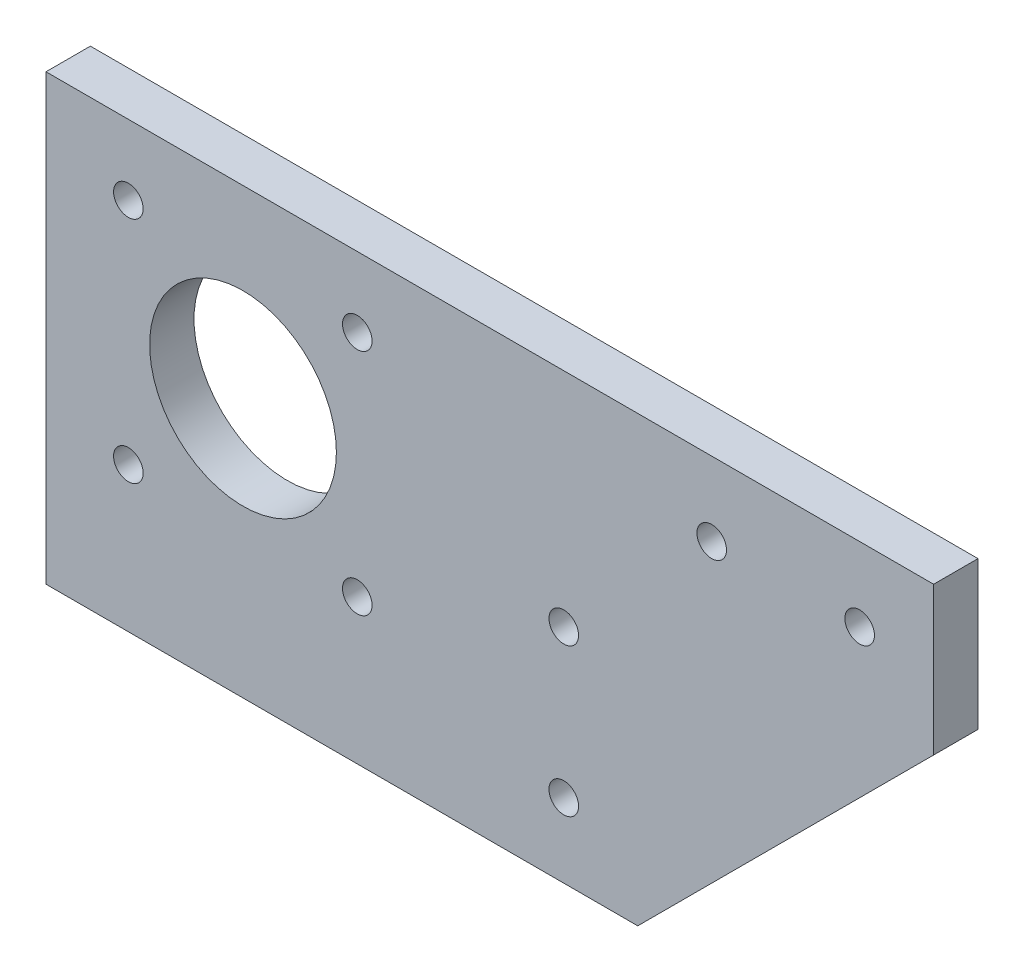
ISO-10303-21;
HEADER;
FILE_DESCRIPTION(('STEP AP214'),'2;1');
FILE_NAME('part.step','',(''),(''),'','','');
FILE_SCHEMA(('AUTOMOTIVE_DESIGN { 1 0 10303 214 1 1 1 1 }'));
ENDSEC;
DATA;
#1=APPLICATION_CONTEXT('core data for automotive mechanical design processes');
#2=APPLICATION_PROTOCOL_DEFINITION('international standard','automotive_design',2000,#1);
#3=PRODUCT_CONTEXT('',#1,'mechanical');
#4=PRODUCT('Part','Part','',(#3));
#5=PRODUCT_RELATED_PRODUCT_CATEGORY('part','',(#4));
#6=PRODUCT_DEFINITION_FORMATION('','',#4);
#7=PRODUCT_DEFINITION_CONTEXT('part definition',#1,'design');
#8=PRODUCT_DEFINITION('design','',#6,#7);
#9=PRODUCT_DEFINITION_SHAPE('','',#8);
#10=(LENGTH_UNIT() NAMED_UNIT(*) SI_UNIT(.MILLI.,.METRE.));
#11=(NAMED_UNIT(*) PLANE_ANGLE_UNIT() SI_UNIT($,.RADIAN.));
#12=(NAMED_UNIT(*) SI_UNIT($,.STERADIAN.) SOLID_ANGLE_UNIT());
#13=UNCERTAINTY_MEASURE_WITH_UNIT(LENGTH_MEASURE(1.E-05),#10,'distance_accuracy_value','');
#14=(GEOMETRIC_REPRESENTATION_CONTEXT(3) GLOBAL_UNCERTAINTY_ASSIGNED_CONTEXT((#13)) GLOBAL_UNIT_ASSIGNED_CONTEXT((#10,
#11,#12)) REPRESENTATION_CONTEXT('',''));
#15=CARTESIAN_POINT('',(0.,0.,0.));
#16=DIRECTION('',(0.,0.,1.));
#17=DIRECTION('',(1.,0.,0.));
#18=AXIS2_PLACEMENT_3D('',#15,#16,#17);
#19=CARTESIAN_POINT('',(0.,0.,6.));
#20=DIRECTION('',(0.,0.,-1.));
#21=DIRECTION('',(-1.,0.,0.));
#22=AXIS2_PLACEMENT_3D('',#19,#20,#21);
#23=PLANE('',#22);
#24=CARTESIAN_POINT('',(-17.9156476479282,-40.43,6.));
#25=DIRECTION('',(0.,0.,-1.));
#26=DIRECTION('',(-1.,0.,0.));
#27=AXIS2_PLACEMENT_3D('',#24,#25,#26);
#28=CIRCLE('',#27,2.00000000000001);
#29=CARTESIAN_POINT('',(-19.9156476479282,-40.43,6.));
#30=VERTEX_POINT('',#29);
#31=EDGE_CURVE('E158',#30,#30,#28,.T.);
#32=ORIENTED_EDGE('',*,*,#31,.T.);
#33=EDGE_LOOP('',(#32));
#34=FACE_BOUND('',#33,.T.);
#35=CARTESIAN_POINT('',(-48.8656476479282,-9.48,6.));
#36=DIRECTION('',(0.,0.,-1.));
#37=DIRECTION('',(-1.,0.,0.));
#38=AXIS2_PLACEMENT_3D('',#35,#36,#37);
#39=CIRCLE('',#38,2.);
#40=CARTESIAN_POINT('',(-50.8656476479281,-9.48,6.));
#41=VERTEX_POINT('',#40);
#42=EDGE_CURVE('E163',#41,#41,#39,.T.);
#43=ORIENTED_EDGE('',*,*,#42,.T.);
#44=EDGE_LOOP('',(#43));
#45=FACE_BOUND('',#44,.T.);
#46=CARTESIAN_POINT('',(-48.8656476479282,-40.43,6.));
#47=DIRECTION('',(0.,0.,-1.));
#48=DIRECTION('',(-1.,0.,0.));
#49=AXIS2_PLACEMENT_3D('',#46,#47,#48);
#50=CIRCLE('',#49,2.00000000000001);
#51=CARTESIAN_POINT('',(-50.8656476479282,-40.43,6.));
#52=VERTEX_POINT('',#51);
#53=EDGE_CURVE('E166',#52,#52,#50,.T.);
#54=ORIENTED_EDGE('',*,*,#53,.T.);
#55=EDGE_LOOP('',(#54));
#56=FACE_BOUND('',#55,.T.);
#57=CARTESIAN_POINT('',(-17.9156476479282,-9.48,6.));
#58=DIRECTION('',(0.,0.,-1.));
#59=DIRECTION('',(-1.,0.,0.));
#60=AXIS2_PLACEMENT_3D('',#57,#58,#59);
#61=CIRCLE('',#60,2.);
#62=CARTESIAN_POINT('',(-19.9156476479282,-9.48,6.));
#63=VERTEX_POINT('',#62);
#64=EDGE_CURVE('E169',#63,#63,#61,.T.);
#65=ORIENTED_EDGE('',*,*,#64,.T.);
#66=EDGE_LOOP('',(#65));
#67=FACE_BOUND('',#66,.T.);
#68=DIRECTION('',(-1.,0.,0.));
#69=VECTOR('',#68,1.);
#70=CARTESIAN_POINT('',(-60.,0.,6.));
#71=LINE('',#70,#69);
#72=CARTESIAN_POINT('',(60.,0.,6.));
#73=VERTEX_POINT('',#72);
#74=CARTESIAN_POINT('',(-60.,0.,6.));
#75=VERTEX_POINT('',#74);
#76=EDGE_CURVE('E51',#73,#75,#71,.T.);
#77=ORIENTED_EDGE('',*,*,#76,.T.);
#78=DIRECTION('',(0.,-1.,0.));
#79=VECTOR('',#78,1.);
#80=CARTESIAN_POINT('',(-60.,-60.,6.));
#81=LINE('',#80,#79);
#82=CARTESIAN_POINT('',(-60.,-60.,6.));
#83=VERTEX_POINT('',#82);
#84=EDGE_CURVE('E86',#75,#83,#81,.T.);
#85=ORIENTED_EDGE('',*,*,#84,.T.);
#86=DIRECTION('',(1.,0.,0.));
#87=VECTOR('',#86,1.);
#88=CARTESIAN_POINT('',(-60.,-60.,6.));
#89=LINE('',#88,#87);
#90=CARTESIAN_POINT('',(20.,-60.,6.));
#91=VERTEX_POINT('',#90);
#92=EDGE_CURVE('E91',#83,#91,#89,.T.);
#93=ORIENTED_EDGE('',*,*,#92,.T.);
#94=DIRECTION('',(0.707106781186548,0.707106781186548,0.));
#95=VECTOR('',#94,1.);
#96=CARTESIAN_POINT('',(20.,-60.,6.));
#97=LINE('',#96,#95);
#98=CARTESIAN_POINT('',(60.,-20.,6.));
#99=VERTEX_POINT('',#98);
#100=EDGE_CURVE('E95',#91,#99,#97,.T.);
#101=ORIENTED_EDGE('',*,*,#100,.T.);
#102=DIRECTION('',(0.,1.,0.));
#103=VECTOR('',#102,1.);
#104=CARTESIAN_POINT('',(60.,0.,6.));
#105=LINE('',#104,#103);
#106=EDGE_CURVE('E106',#99,#73,#105,.T.);
#107=ORIENTED_EDGE('',*,*,#106,.T.);
#108=EDGE_LOOP('',(#77,#85,#93,#101,#107));
#109=FACE_BOUND('',#108,.T.);
#110=CARTESIAN_POINT('',(50.,-10.,6.));
#111=DIRECTION('',(0.,0.,1.));
#112=DIRECTION('',(1.,0.,0.));
#113=AXIS2_PLACEMENT_3D('',#110,#111,#112);
#114=CIRCLE('',#113,2.);
#115=CARTESIAN_POINT('',(52.,-10.,6.));
#116=VERTEX_POINT('',#115);
#117=EDGE_CURVE('E115',#116,#116,#114,.T.);
#118=ORIENTED_EDGE('',*,*,#117,.F.);
#119=EDGE_LOOP('',(#118));
#120=FACE_BOUND('',#119,.T.);
#121=CARTESIAN_POINT('',(30.,-10.,6.));
#122=DIRECTION('',(0.,0.,1.));
#123=DIRECTION('',(1.,0.,0.));
#124=AXIS2_PLACEMENT_3D('',#121,#122,#123);
#125=CIRCLE('',#124,2.);
#126=CARTESIAN_POINT('',(32.,-10.,6.));
#127=VERTEX_POINT('',#126);
#128=EDGE_CURVE('E134',#127,#127,#125,.T.);
#129=ORIENTED_EDGE('',*,*,#128,.F.);
#130=EDGE_LOOP('',(#129));
#131=FACE_BOUND('',#130,.T.);
#132=CARTESIAN_POINT('',(10.,-50.,6.));
#133=DIRECTION('',(0.,0.,1.));
#134=DIRECTION('',(1.,0.,0.));
#135=AXIS2_PLACEMENT_3D('',#132,#133,#134);
#136=CIRCLE('',#135,2.);
#137=CARTESIAN_POINT('',(12.,-50.,6.));
#138=VERTEX_POINT('',#137);
#139=EDGE_CURVE('E140',#138,#138,#136,.T.);
#140=ORIENTED_EDGE('',*,*,#139,.F.);
#141=EDGE_LOOP('',(#140));
#142=FACE_BOUND('',#141,.T.);
#143=CARTESIAN_POINT('',(10.,-30.,6.));
#144=DIRECTION('',(0.,0.,1.));
#145=DIRECTION('',(1.,0.,0.));
#146=AXIS2_PLACEMENT_3D('',#143,#144,#145);
#147=CIRCLE('',#146,2.);
#148=CARTESIAN_POINT('',(12.,-30.,6.));
#149=VERTEX_POINT('',#148);
#150=EDGE_CURVE('E146',#149,#149,#147,.T.);
#151=ORIENTED_EDGE('',*,*,#150,.F.);
#152=EDGE_LOOP('',(#151));
#153=FACE_BOUND('',#152,.T.);
#154=CARTESIAN_POINT('',(-33.3656476479282,-24.93,6.));
#155=DIRECTION('',(0.,0.,1.));
#156=DIRECTION('',(1.,0.,0.));
#157=AXIS2_PLACEMENT_3D('',#154,#155,#156);
#158=CIRCLE('',#157,12.6259865876526);
#159=CARTESIAN_POINT('',(-20.7396610602755,-24.93,6.));
#160=VERTEX_POINT('',#159);
#161=EDGE_CURVE('E152',#160,#160,#158,.T.);
#162=ORIENTED_EDGE('',*,*,#161,.F.);
#163=EDGE_LOOP('',(#162));
#164=FACE_BOUND('',#163,.T.);
#165=ADVANCED_FACE('F34',(#34,#45,#56,#67,#109,#120,#131,#142,#153,#164),#23,.F.);
#166=CARTESIAN_POINT('',(0.,0.,0.));
#167=DIRECTION('',(0.,0.,-1.));
#168=DIRECTION('',(-1.,0.,0.));
#169=AXIS2_PLACEMENT_3D('',#166,#167,#168);
#170=PLANE('',#169);
#171=CARTESIAN_POINT('',(-17.9156476479282,-40.43,0.));
#172=DIRECTION('',(0.,0.,-1.));
#173=DIRECTION('',(-1.,0.,0.));
#174=AXIS2_PLACEMENT_3D('',#171,#172,#173);
#175=CIRCLE('',#174,2.00000000000001);
#176=CARTESIAN_POINT('',(-19.9156476479282,-40.43,0.));
#177=VERTEX_POINT('',#176);
#178=EDGE_CURVE('E175',#177,#177,#175,.T.);
#179=ORIENTED_EDGE('',*,*,#178,.F.);
#180=EDGE_LOOP('',(#179));
#181=FACE_BOUND('',#180,.T.);
#182=CARTESIAN_POINT('',(-48.8656476479282,-9.48,0.));
#183=DIRECTION('',(0.,0.,-1.));
#184=DIRECTION('',(1.,0.,0.));
#185=AXIS2_PLACEMENT_3D('',#182,#183,#184);
#186=CIRCLE('',#185,2.);
#187=CARTESIAN_POINT('',(-46.8656476479282,-9.48,0.));
#188=VERTEX_POINT('',#187);
#189=EDGE_CURVE('E176',#188,#188,#186,.T.);
#190=ORIENTED_EDGE('',*,*,#189,.F.);
#191=EDGE_LOOP('',(#190));
#192=FACE_BOUND('',#191,.T.);
#193=CARTESIAN_POINT('',(-48.8656476479282,-40.43,0.));
#194=DIRECTION('',(0.,0.,-1.));
#195=DIRECTION('',(1.,0.,0.));
#196=AXIS2_PLACEMENT_3D('',#193,#194,#195);
#197=CIRCLE('',#196,2.00000000000001);
#198=CARTESIAN_POINT('',(-46.8656476479281,-40.43,0.));
#199=VERTEX_POINT('',#198);
#200=EDGE_CURVE('E179',#199,#199,#197,.T.);
#201=ORIENTED_EDGE('',*,*,#200,.F.);
#202=EDGE_LOOP('',(#201));
#203=FACE_BOUND('',#202,.T.);
#204=CARTESIAN_POINT('',(-17.9156476479282,-9.48,0.));
#205=DIRECTION('',(0.,0.,-1.));
#206=DIRECTION('',(-1.,0.,0.));
#207=AXIS2_PLACEMENT_3D('',#204,#205,#206);
#208=CIRCLE('',#207,2.);
#209=CARTESIAN_POINT('',(-19.9156476479282,-9.48,0.));
#210=VERTEX_POINT('',#209);
#211=EDGE_CURVE('E172',#210,#210,#208,.T.);
#212=ORIENTED_EDGE('',*,*,#211,.F.);
#213=EDGE_LOOP('',(#212));
#214=FACE_BOUND('',#213,.T.);
#215=CARTESIAN_POINT('',(10.,-30.,0.));
#216=DIRECTION('',(0.,0.,1.));
#217=DIRECTION('',(1.,0.,0.));
#218=AXIS2_PLACEMENT_3D('',#215,#216,#217);
#219=CIRCLE('',#218,2.);
#220=CARTESIAN_POINT('',(12.,-30.,0.));
#221=VERTEX_POINT('',#220);
#222=EDGE_CURVE('E149',#221,#221,#219,.T.);
#223=ORIENTED_EDGE('',*,*,#222,.T.);
#224=EDGE_LOOP('',(#223));
#225=FACE_BOUND('',#224,.T.);
#226=CARTESIAN_POINT('',(30.,-10.,0.));
#227=DIRECTION('',(0.,0.,1.));
#228=DIRECTION('',(1.,0.,0.));
#229=AXIS2_PLACEMENT_3D('',#226,#227,#228);
#230=CIRCLE('',#229,2.);
#231=CARTESIAN_POINT('',(32.,-10.,0.));
#232=VERTEX_POINT('',#231);
#233=EDGE_CURVE('E137',#232,#232,#230,.T.);
#234=ORIENTED_EDGE('',*,*,#233,.T.);
#235=EDGE_LOOP('',(#234));
#236=FACE_BOUND('',#235,.T.);
#237=DIRECTION('',(0.,-1.,0.));
#238=VECTOR('',#237,1.);
#239=CARTESIAN_POINT('',(-60.,-60.,0.));
#240=LINE('',#239,#238);
#241=CARTESIAN_POINT('',(-60.,0.,0.));
#242=VERTEX_POINT('',#241);
#243=CARTESIAN_POINT('',(-60.,-60.,0.));
#244=VERTEX_POINT('',#243);
#245=EDGE_CURVE('E112',#242,#244,#240,.T.);
#246=ORIENTED_EDGE('',*,*,#245,.F.);
#247=DIRECTION('',(-1.,0.,0.));
#248=VECTOR('',#247,1.);
#249=CARTESIAN_POINT('',(0.,0.,0.));
#250=LINE('',#249,#248);
#251=CARTESIAN_POINT('',(60.,0.,0.));
#252=VERTEX_POINT('',#251);
#253=EDGE_CURVE('E119',#252,#242,#250,.T.);
#254=ORIENTED_EDGE('',*,*,#253,.F.);
#255=DIRECTION('',(0.,1.,0.));
#256=VECTOR('',#255,1.);
#257=CARTESIAN_POINT('',(60.,0.,0.));
#258=LINE('',#257,#256);
#259=CARTESIAN_POINT('',(60.,-20.,0.));
#260=VERTEX_POINT('',#259);
#261=EDGE_CURVE('E79',#260,#252,#258,.T.);
#262=ORIENTED_EDGE('',*,*,#261,.F.);
#263=DIRECTION('',(0.707106781186548,0.707106781186548,0.));
#264=VECTOR('',#263,1.);
#265=CARTESIAN_POINT('',(20.,-60.,0.));
#266=LINE('',#265,#264);
#267=CARTESIAN_POINT('',(20.,-60.,0.));
#268=VERTEX_POINT('',#267);
#269=EDGE_CURVE('E72',#268,#260,#266,.T.);
#270=ORIENTED_EDGE('',*,*,#269,.F.);
#271=DIRECTION('',(1.,0.,0.));
#272=VECTOR('',#271,1.);
#273=CARTESIAN_POINT('',(0.,-60.,0.));
#274=LINE('',#273,#272);
#275=EDGE_CURVE('E101',#244,#268,#274,.T.);
#276=ORIENTED_EDGE('',*,*,#275,.F.);
#277=EDGE_LOOP('',(#246,#254,#262,#270,#276));
#278=FACE_BOUND('',#277,.T.);
#279=CARTESIAN_POINT('',(50.,-10.,0.));
#280=DIRECTION('',(0.,0.,1.));
#281=DIRECTION('',(1.,0.,0.));
#282=AXIS2_PLACEMENT_3D('',#279,#280,#281);
#283=CIRCLE('',#282,2.);
#284=CARTESIAN_POINT('',(52.,-10.,0.));
#285=VERTEX_POINT('',#284);
#286=EDGE_CURVE('E131',#285,#285,#283,.T.);
#287=ORIENTED_EDGE('',*,*,#286,.T.);
#288=EDGE_LOOP('',(#287));
#289=FACE_BOUND('',#288,.T.);
#290=CARTESIAN_POINT('',(10.,-50.,0.));
#291=DIRECTION('',(0.,0.,1.));
#292=DIRECTION('',(1.,0.,0.));
#293=AXIS2_PLACEMENT_3D('',#290,#291,#292);
#294=CIRCLE('',#293,2.);
#295=CARTESIAN_POINT('',(12.,-50.,0.));
#296=VERTEX_POINT('',#295);
#297=EDGE_CURVE('E143',#296,#296,#294,.T.);
#298=ORIENTED_EDGE('',*,*,#297,.T.);
#299=EDGE_LOOP('',(#298));
#300=FACE_BOUND('',#299,.T.);
#301=CARTESIAN_POINT('',(-33.3656476479282,-24.93,0.));
#302=DIRECTION('',(0.,0.,1.));
#303=DIRECTION('',(1.,0.,0.));
#304=AXIS2_PLACEMENT_3D('',#301,#302,#303);
#305=CIRCLE('',#304,12.6259865876526);
#306=CARTESIAN_POINT('',(-20.7396610602755,-24.93,0.));
#307=VERTEX_POINT('',#306);
#308=EDGE_CURVE('E155',#307,#307,#305,.T.);
#309=ORIENTED_EDGE('',*,*,#308,.T.);
#310=EDGE_LOOP('',(#309));
#311=FACE_BOUND('',#310,.T.);
#312=ADVANCED_FACE('F125',(#181,#192,#203,#214,#225,#236,#278,#289,#300,#311),#170,.T.);
#313=CARTESIAN_POINT('',(-60.,-60.,6.));
#314=DIRECTION('',(1.,0.,0.));
#315=DIRECTION('',(0.,0.,-1.));
#316=AXIS2_PLACEMENT_3D('',#313,#314,#315);
#317=PLANE('',#316);
#318=ORIENTED_EDGE('',*,*,#245,.T.);
#319=DIRECTION('',(0.,0.,-1.));
#320=VECTOR('',#319,1.);
#321=CARTESIAN_POINT('',(-60.,-60.,6.));
#322=LINE('',#321,#320);
#323=EDGE_CURVE('E43',#83,#244,#322,.T.);
#324=ORIENTED_EDGE('',*,*,#323,.F.);
#325=ORIENTED_EDGE('',*,*,#84,.F.);
#326=DIRECTION('',(0.,0.,-1.));
#327=VECTOR('',#326,1.);
#328=CARTESIAN_POINT('',(-60.,0.,6.));
#329=LINE('',#328,#327);
#330=EDGE_CURVE('E11',#75,#242,#329,.T.);
#331=ORIENTED_EDGE('',*,*,#330,.T.);
#332=EDGE_LOOP('',(#318,#324,#325,#331));
#333=FACE_BOUND('',#332,.T.);
#334=ADVANCED_FACE('F36',(#333),#317,.F.);
#335=CARTESIAN_POINT('',(0.,-60.,6.));
#336=DIRECTION('',(0.,1.,0.));
#337=DIRECTION('',(0.,0.,1.));
#338=AXIS2_PLACEMENT_3D('',#335,#336,#337);
#339=PLANE('',#338);
#340=ORIENTED_EDGE('',*,*,#275,.T.);
#341=DIRECTION('',(0.,0.,-1.));
#342=VECTOR('',#341,1.);
#343=CARTESIAN_POINT('',(20.,-60.,6.));
#344=LINE('',#343,#342);
#345=EDGE_CURVE('E99',#91,#268,#344,.T.);
#346=ORIENTED_EDGE('',*,*,#345,.F.);
#347=ORIENTED_EDGE('',*,*,#92,.F.);
#348=ORIENTED_EDGE('',*,*,#323,.T.);
#349=EDGE_LOOP('',(#340,#346,#347,#348));
#350=FACE_BOUND('',#349,.T.);
#351=ADVANCED_FACE('F100',(#350),#339,.F.);
#352=CARTESIAN_POINT('',(20.,-60.,6.));
#353=DIRECTION('',(-0.707106781186547,0.707106781186547,0.));
#354=DIRECTION('',(-0.707106781186548,-0.707106781186548,0.));
#355=AXIS2_PLACEMENT_3D('',#352,#353,#354);
#356=PLANE('',#355);
#357=ORIENTED_EDGE('',*,*,#269,.T.);
#358=DIRECTION('',(0.,0.,-1.));
#359=VECTOR('',#358,1.);
#360=CARTESIAN_POINT('',(60.,-20.,6.));
#361=LINE('',#360,#359);
#362=EDGE_CURVE('E102',#99,#260,#361,.T.);
#363=ORIENTED_EDGE('',*,*,#362,.F.);
#364=ORIENTED_EDGE('',*,*,#100,.F.);
#365=ORIENTED_EDGE('',*,*,#345,.T.);
#366=EDGE_LOOP('',(#357,#363,#364,#365));
#367=FACE_BOUND('',#366,.T.);
#368=ADVANCED_FACE('F104',(#367),#356,.F.);
#369=CARTESIAN_POINT('',(60.,0.,6.));
#370=DIRECTION('',(-1.,0.,0.));
#371=DIRECTION('',(0.,0.,1.));
#372=AXIS2_PLACEMENT_3D('',#369,#370,#371);
#373=PLANE('',#372);
#374=ORIENTED_EDGE('',*,*,#261,.T.);
#375=DIRECTION('',(0.,0.,-1.));
#376=VECTOR('',#375,1.);
#377=CARTESIAN_POINT('',(60.,0.,6.));
#378=LINE('',#377,#376);
#379=EDGE_CURVE('E108',#73,#252,#378,.T.);
#380=ORIENTED_EDGE('',*,*,#379,.F.);
#381=ORIENTED_EDGE('',*,*,#106,.F.);
#382=ORIENTED_EDGE('',*,*,#362,.T.);
#383=EDGE_LOOP('',(#374,#380,#381,#382));
#384=FACE_BOUND('',#383,.T.);
#385=ADVANCED_FACE('F128',(#384),#373,.F.);
#386=CARTESIAN_POINT('',(0.,0.,6.));
#387=DIRECTION('',(0.,-1.,0.));
#388=DIRECTION('',(0.,0.,-1.));
#389=AXIS2_PLACEMENT_3D('',#386,#387,#388);
#390=PLANE('',#389);
#391=ORIENTED_EDGE('',*,*,#253,.T.);
#392=ORIENTED_EDGE('',*,*,#330,.F.);
#393=ORIENTED_EDGE('',*,*,#76,.F.);
#394=ORIENTED_EDGE('',*,*,#379,.T.);
#395=EDGE_LOOP('',(#391,#392,#393,#394));
#396=FACE_BOUND('',#395,.T.);
#397=ADVANCED_FACE('F127',(#396),#390,.F.);
#398=CARTESIAN_POINT('',(50.,-10.,6.));
#399=DIRECTION('',(0.,0.,-1.));
#400=DIRECTION('',(-1.,0.,0.));
#401=AXIS2_PLACEMENT_3D('',#398,#399,#400);
#402=CYLINDRICAL_SURFACE('',#401,2.);
#403=ORIENTED_EDGE('',*,*,#117,.T.);
#404=EDGE_LOOP('',(#403));
#405=FACE_BOUND('',#404,.T.);
#406=ORIENTED_EDGE('',*,*,#286,.F.);
#407=EDGE_LOOP('',(#406));
#408=FACE_BOUND('',#407,.T.);
#409=ADVANCED_FACE('F201',(#405,#408),#402,.F.);
#410=CARTESIAN_POINT('',(30.,-10.,6.));
#411=DIRECTION('',(0.,0.,-1.));
#412=DIRECTION('',(-1.,0.,0.));
#413=AXIS2_PLACEMENT_3D('',#410,#411,#412);
#414=CYLINDRICAL_SURFACE('',#413,2.);
#415=ORIENTED_EDGE('',*,*,#128,.T.);
#416=EDGE_LOOP('',(#415));
#417=FACE_BOUND('',#416,.T.);
#418=ORIENTED_EDGE('',*,*,#233,.F.);
#419=EDGE_LOOP('',(#418));
#420=FACE_BOUND('',#419,.T.);
#421=ADVANCED_FACE('F198',(#417,#420),#414,.F.);
#422=CARTESIAN_POINT('',(10.,-50.,6.));
#423=DIRECTION('',(0.,0.,-1.));
#424=DIRECTION('',(-1.,0.,0.));
#425=AXIS2_PLACEMENT_3D('',#422,#423,#424);
#426=CYLINDRICAL_SURFACE('',#425,2.);
#427=ORIENTED_EDGE('',*,*,#139,.T.);
#428=EDGE_LOOP('',(#427));
#429=FACE_BOUND('',#428,.T.);
#430=ORIENTED_EDGE('',*,*,#297,.F.);
#431=EDGE_LOOP('',(#430));
#432=FACE_BOUND('',#431,.T.);
#433=ADVANCED_FACE('F200',(#429,#432),#426,.F.);
#434=CARTESIAN_POINT('',(10.,-30.,6.));
#435=DIRECTION('',(0.,0.,-1.));
#436=DIRECTION('',(-1.,0.,0.));
#437=AXIS2_PLACEMENT_3D('',#434,#435,#436);
#438=CYLINDRICAL_SURFACE('',#437,2.);
#439=ORIENTED_EDGE('',*,*,#150,.T.);
#440=EDGE_LOOP('',(#439));
#441=FACE_BOUND('',#440,.T.);
#442=ORIENTED_EDGE('',*,*,#222,.F.);
#443=EDGE_LOOP('',(#442));
#444=FACE_BOUND('',#443,.T.);
#445=ADVANCED_FACE('F208',(#441,#444),#438,.F.);
#446=CARTESIAN_POINT('',(-33.3656476479282,-24.93,6.));
#447=DIRECTION('',(0.,0.,-1.));
#448=DIRECTION('',(-1.,0.,0.));
#449=AXIS2_PLACEMENT_3D('',#446,#447,#448);
#450=CYLINDRICAL_SURFACE('',#449,12.6259865876526);
#451=ORIENTED_EDGE('',*,*,#161,.T.);
#452=EDGE_LOOP('',(#451));
#453=FACE_BOUND('',#452,.T.);
#454=ORIENTED_EDGE('',*,*,#308,.F.);
#455=EDGE_LOOP('',(#454));
#456=FACE_BOUND('',#455,.T.);
#457=ADVANCED_FACE('F248',(#453,#456),#450,.F.);
#458=CARTESIAN_POINT('',(-17.9156476479282,-9.48,10.));
#459=DIRECTION('',(0.,0.,-1.));
#460=DIRECTION('',(-1.,0.,0.));
#461=AXIS2_PLACEMENT_3D('',#458,#459,#460);
#462=CYLINDRICAL_SURFACE('',#461,2.);
#463=ORIENTED_EDGE('',*,*,#211,.T.);
#464=EDGE_LOOP('',(#463));
#465=FACE_BOUND('',#464,.T.);
#466=ORIENTED_EDGE('',*,*,#64,.F.);
#467=EDGE_LOOP('',(#466));
#468=FACE_BOUND('',#467,.T.);
#469=ADVANCED_FACE('F243',(#465,#468),#462,.F.);
#470=CARTESIAN_POINT('',(-48.8656476479282,-40.43,10.));
#471=DIRECTION('',(0.,0.,-1.));
#472=DIRECTION('',(-1.,0.,0.));
#473=AXIS2_PLACEMENT_3D('',#470,#471,#472);
#474=CYLINDRICAL_SURFACE('',#473,2.00000000000001);
#475=ORIENTED_EDGE('',*,*,#200,.T.);
#476=EDGE_LOOP('',(#475));
#477=FACE_BOUND('',#476,.T.);
#478=ORIENTED_EDGE('',*,*,#53,.F.);
#479=EDGE_LOOP('',(#478));
#480=FACE_BOUND('',#479,.T.);
#481=ADVANCED_FACE('F185',(#477,#480),#474,.F.);
#482=CARTESIAN_POINT('',(-48.8656476479282,-9.48,10.));
#483=DIRECTION('',(0.,0.,-1.));
#484=DIRECTION('',(-1.,0.,0.));
#485=AXIS2_PLACEMENT_3D('',#482,#483,#484);
#486=CYLINDRICAL_SURFACE('',#485,2.);
#487=ORIENTED_EDGE('',*,*,#189,.T.);
#488=EDGE_LOOP('',(#487));
#489=FACE_BOUND('',#488,.T.);
#490=ORIENTED_EDGE('',*,*,#42,.F.);
#491=EDGE_LOOP('',(#490));
#492=FACE_BOUND('',#491,.T.);
#493=ADVANCED_FACE('F260',(#489,#492),#486,.F.);
#494=CARTESIAN_POINT('',(-17.9156476479282,-40.43,10.));
#495=DIRECTION('',(0.,0.,-1.));
#496=DIRECTION('',(-1.,0.,0.));
#497=AXIS2_PLACEMENT_3D('',#494,#495,#496);
#498=CYLINDRICAL_SURFACE('',#497,2.00000000000001);
#499=ORIENTED_EDGE('',*,*,#178,.T.);
#500=EDGE_LOOP('',(#499));
#501=FACE_BOUND('',#500,.T.);
#502=ORIENTED_EDGE('',*,*,#31,.F.);
#503=EDGE_LOOP('',(#502));
#504=FACE_BOUND('',#503,.T.);
#505=ADVANCED_FACE('F269',(#501,#504),#498,.F.);
#506=CLOSED_SHELL('',(#165,#312,#334,#351,#368,#385,#397,#409,#421,#433,#445,#457,#469,#481,
#493,#505));
#507=MANIFOLD_SOLID_BREP('B2',#506);
#508=ADVANCED_BREP_SHAPE_REPRESENTATION('',(#18,#507),#14);
#509=SHAPE_DEFINITION_REPRESENTATION(#9,#508);
ENDSEC;
END-ISO-10303-21;
